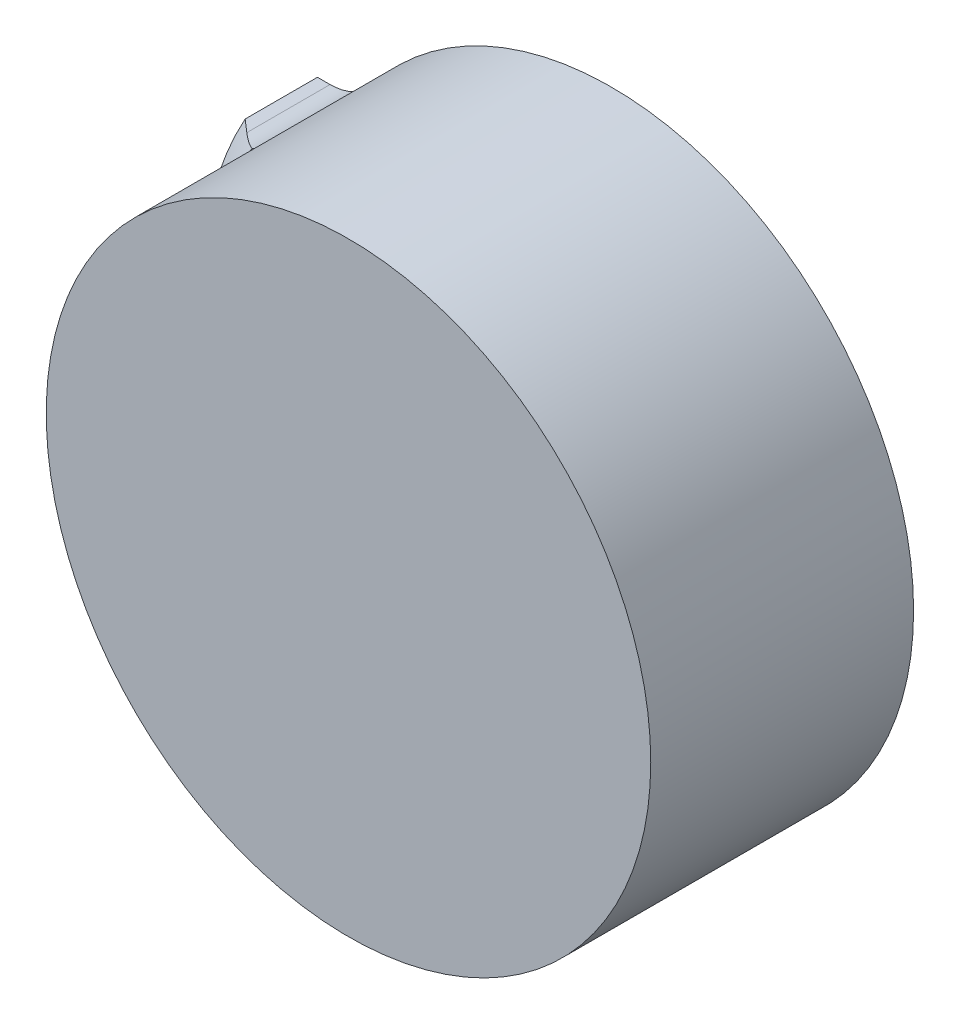
ISO-10303-21;
HEADER;
FILE_DESCRIPTION(('STEP AP214'),'2;1');
FILE_NAME('part.step','',(''),(''),'','','');
FILE_SCHEMA(('AUTOMOTIVE_DESIGN { 1 0 10303 214 1 1 1 1 }'));
ENDSEC;
DATA;
#1=APPLICATION_CONTEXT('core data for automotive mechanical design processes');
#2=APPLICATION_PROTOCOL_DEFINITION('international standard','automotive_design',2000,#1);
#3=PRODUCT_CONTEXT('',#1,'mechanical');
#4=PRODUCT('Part','Part','',(#3));
#5=PRODUCT_RELATED_PRODUCT_CATEGORY('part','',(#4));
#6=PRODUCT_DEFINITION_FORMATION('','',#4);
#7=PRODUCT_DEFINITION_CONTEXT('part definition',#1,'design');
#8=PRODUCT_DEFINITION('design','',#6,#7);
#9=PRODUCT_DEFINITION_SHAPE('','',#8);
#10=(LENGTH_UNIT() NAMED_UNIT(*) SI_UNIT(.MILLI.,.METRE.));
#11=(NAMED_UNIT(*) PLANE_ANGLE_UNIT() SI_UNIT($,.RADIAN.));
#12=(NAMED_UNIT(*) SI_UNIT($,.STERADIAN.) SOLID_ANGLE_UNIT());
#13=UNCERTAINTY_MEASURE_WITH_UNIT(LENGTH_MEASURE(1.E-05),#10,'distance_accuracy_value','');
#14=(GEOMETRIC_REPRESENTATION_CONTEXT(3) GLOBAL_UNCERTAINTY_ASSIGNED_CONTEXT((#13)) GLOBAL_UNIT_ASSIGNED_CONTEXT((#10,
#11,#12)) REPRESENTATION_CONTEXT('',''));
#15=CARTESIAN_POINT('',(0.,0.,0.));
#16=DIRECTION('',(0.,0.,1.));
#17=DIRECTION('',(1.,0.,0.));
#18=AXIS2_PLACEMENT_3D('',#15,#16,#17);
#19=CARTESIAN_POINT('',(0.,0.,20.));
#20=DIRECTION('',(0.,0.,-1.));
#21=DIRECTION('',(-1.,0.,0.));
#22=AXIS2_PLACEMENT_3D('',#19,#20,#21);
#23=CYLINDRICAL_SURFACE('',#22,23.);
#24=CARTESIAN_POINT('',(0.,0.,20.));
#25=DIRECTION('',(0.,0.,1.));
#26=DIRECTION('',(1.,0.,0.));
#27=AXIS2_PLACEMENT_3D('',#24,#25,#26);
#28=CIRCLE('',#27,23.);
#29=CARTESIAN_POINT('',(23.,0.,20.));
#30=VERTEX_POINT('',#29);
#31=EDGE_CURVE('E129',#30,#30,#28,.T.);
#32=ORIENTED_EDGE('',*,*,#31,.F.);
#33=EDGE_LOOP('',(#32));
#34=FACE_BOUND('',#33,.T.);
#35=CARTESIAN_POINT('',(0.,0.,7.5));
#36=DIRECTION('',(0.,0.,1.));
#37=DIRECTION('',(1.,0.,0.));
#38=AXIS2_PLACEMENT_3D('',#35,#36,#37);
#39=CIRCLE('',#38,23.);
#40=CARTESIAN_POINT('',(-18.2312203490727,14.0222182476083,7.5));
#41=VERTEX_POINT('',#40);
#42=CARTESIAN_POINT('',(-18.2312203490718,-14.0222182476094,7.5));
#43=VERTEX_POINT('',#42);
#44=EDGE_CURVE('E132',#41,#43,#39,.T.);
#45=ORIENTED_EDGE('',*,*,#44,.T.);
#46=DIRECTION('',(0.,0.,-1.));
#47=VECTOR('',#46,1.);
#48=CARTESIAN_POINT('',(-18.2312203490718,-14.0222182476094,20.));
#49=LINE('',#48,#47);
#50=CARTESIAN_POINT('',(-18.2312203490718,-14.0222182476094,0.));
#51=VERTEX_POINT('',#50);
#52=EDGE_CURVE('E170',#43,#51,#49,.T.);
#53=ORIENTED_EDGE('',*,*,#52,.T.);
#54=CARTESIAN_POINT('',(0.,0.,0.));
#55=DIRECTION('',(0.,0.,1.));
#56=DIRECTION('',(1.,0.,0.));
#57=AXIS2_PLACEMENT_3D('',#54,#55,#56);
#58=CIRCLE('',#57,23.);
#59=CARTESIAN_POINT('',(-18.2312203490727,14.0222182476083,0.));
#60=VERTEX_POINT('',#59);
#61=EDGE_CURVE('E109',#51,#60,#58,.T.);
#62=ORIENTED_EDGE('',*,*,#61,.T.);
#63=DIRECTION('',(0.,0.,-1.));
#64=VECTOR('',#63,1.);
#65=CARTESIAN_POINT('',(-18.2312203490727,14.0222182476083,20.));
#66=LINE('',#65,#64);
#67=EDGE_CURVE('E172',#60,#41,#66,.F.);
#68=ORIENTED_EDGE('',*,*,#67,.T.);
#69=EDGE_LOOP('',(#45,#53,#62,#68));
#70=FACE_BOUND('',#69,.T.);
#71=ADVANCED_FACE('F37',(#34,#70),#23,.T.);
#72=CARTESIAN_POINT('',(0.,0.,20.));
#73=DIRECTION('',(0.,0.,1.));
#74=DIRECTION('',(1.,0.,0.));
#75=AXIS2_PLACEMENT_3D('',#72,#73,#74);
#76=PLANE('',#75);
#77=ORIENTED_EDGE('',*,*,#31,.T.);
#78=EDGE_LOOP('',(#77));
#79=FACE_BOUND('',#78,.T.);
#80=ADVANCED_FACE('F157',(#79),#76,.T.);
#81=CARTESIAN_POINT('',(0.,0.,0.));
#82=DIRECTION('',(0.,0.,1.));
#83=DIRECTION('',(1.,0.,0.));
#84=AXIS2_PLACEMENT_3D('',#81,#82,#83);
#85=PLANE('',#84);
#86=ORIENTED_EDGE('',*,*,#61,.F.);
#87=CARTESIAN_POINT('',(-21.4018673663017,-16.4608648993676,0.));
#88=DIRECTION('',(0.,0.,1.));
#89=DIRECTION('',(1.,0.,0.));
#90=AXIS2_PLACEMENT_3D('',#87,#88,#89);
#91=CIRCLE('',#90,4.);
#92=CARTESIAN_POINT('',(-21.4018673663017,-12.4608648993676,0.));
#93=VERTEX_POINT('',#92);
#94=EDGE_CURVE('E119',#51,#93,#91,.T.);
#95=ORIENTED_EDGE('',*,*,#94,.T.);
#96=DIRECTION('',(1.,0.,0.));
#97=VECTOR('',#96,1.);
#98=CARTESIAN_POINT('',(-17.5671731433861,-12.4608648993676,0.));
#99=LINE('',#98,#97);
#100=CARTESIAN_POINT('',(-22.3626216253755,-12.4608648993676,0.));
#101=VERTEX_POINT('',#100);
#102=EDGE_CURVE('E102',#101,#93,#99,.T.);
#103=ORIENTED_EDGE('',*,*,#102,.F.);
#104=CARTESIAN_POINT('',(0.,0.,0.));
#105=DIRECTION('',(0.,0.,1.));
#106=DIRECTION('',(1.,0.,0.));
#107=AXIS2_PLACEMENT_3D('',#104,#105,#106);
#108=CIRCLE('',#107,25.6000000000001);
#109=CARTESIAN_POINT('',(-22.3626216253763,12.4608648993662,0.));
#110=VERTEX_POINT('',#109);
#111=EDGE_CURVE('E117',#110,#101,#108,.T.);
#112=ORIENTED_EDGE('',*,*,#111,.F.);
#113=DIRECTION('',(-1.,0.,0.));
#114=VECTOR('',#113,1.);
#115=CARTESIAN_POINT('',(-22.3626216253763,12.4608648993662,0.));
#116=LINE('',#115,#114);
#117=CARTESIAN_POINT('',(-21.4018673663027,12.4608648993662,0.));
#118=VERTEX_POINT('',#117);
#119=EDGE_CURVE('E120',#118,#110,#116,.T.);
#120=ORIENTED_EDGE('',*,*,#119,.F.);
#121=CARTESIAN_POINT('',(-21.4018673663027,16.4608648993662,0.));
#122=DIRECTION('',(0.,0.,1.));
#123=DIRECTION('',(1.,0.,0.));
#124=AXIS2_PLACEMENT_3D('',#121,#122,#123);
#125=CIRCLE('',#124,4.);
#126=EDGE_CURVE('E210',#118,#60,#125,.T.);
#127=ORIENTED_EDGE('',*,*,#126,.T.);
#128=EDGE_LOOP('',(#86,#95,#103,#112,#120,#127));
#129=FACE_BOUND('',#128,.T.);
#130=ADVANCED_FACE('F115',(#129),#85,.F.);
#131=CARTESIAN_POINT('',(0.,0.,7.5));
#132=DIRECTION('',(0.,0.,1.));
#133=DIRECTION('',(1.,0.,0.));
#134=AXIS2_PLACEMENT_3D('',#131,#132,#133);
#135=PLANE('',#134);
#136=ORIENTED_EDGE('',*,*,#44,.F.);
#137=CARTESIAN_POINT('',(-21.4018673663027,16.4608648993662,7.5));
#138=DIRECTION('',(0.,0.,1.));
#139=DIRECTION('',(1.,0.,0.));
#140=AXIS2_PLACEMENT_3D('',#137,#138,#139);
#141=CIRCLE('',#140,4.);
#142=CARTESIAN_POINT('',(-19.8416281950736,12.7777067805011,7.5));
#143=VERTEX_POINT('',#142);
#144=EDGE_CURVE('E50',#41,#143,#141,.F.);
#145=ORIENTED_EDGE('',*,*,#144,.T.);
#146=CARTESIAN_POINT('',(0.,0.,7.5));
#147=DIRECTION('',(0.,0.,1.));
#148=DIRECTION('',(1.,0.,0.));
#149=AXIS2_PLACEMENT_3D('',#146,#147,#148);
#150=CIRCLE('',#149,23.6000000000001);
#151=CARTESIAN_POINT('',(-19.8416281950728,-12.7777067805023,7.5));
#152=VERTEX_POINT('',#151);
#153=EDGE_CURVE('E56',#143,#152,#150,.T.);
#154=ORIENTED_EDGE('',*,*,#153,.T.);
#155=CARTESIAN_POINT('',(-21.4018673663017,-16.4608648993676,7.5));
#156=DIRECTION('',(0.,0.,1.));
#157=DIRECTION('',(1.,0.,0.));
#158=AXIS2_PLACEMENT_3D('',#155,#156,#157);
#159=CIRCLE('',#158,4.);
#160=EDGE_CURVE('E175',#152,#43,#159,.F.);
#161=ORIENTED_EDGE('',*,*,#160,.T.);
#162=EDGE_LOOP('',(#136,#145,#154,#161));
#163=FACE_BOUND('',#162,.T.);
#164=ADVANCED_FACE('F152',(#163),#135,.T.);
#165=CARTESIAN_POINT('',(-17.5671731433861,-12.4608648993676,7.5));
#166=DIRECTION('',(0.,1.,0.));
#167=DIRECTION('',(-1.,0.,0.));
#168=AXIS2_PLACEMENT_3D('',#165,#166,#167);
#169=PLANE('',#168);
#170=ORIENTED_EDGE('',*,*,#102,.T.);
#171=DIRECTION('',(0.,0.,1.));
#172=VECTOR('',#171,1.);
#173=CARTESIAN_POINT('',(-21.4018673663017,-12.4608648993676,7.5));
#174=LINE('',#173,#172);
#175=CARTESIAN_POINT('',(-21.4018673662919,-12.4608648993676,6.33484139350931));
#176=VERTEX_POINT('',#175);
#177=EDGE_CURVE('E184',#93,#176,#174,.T.);
#178=ORIENTED_EDGE('',*,*,#177,.T.);
#179=CARTESIAN_POINT('',(-20.042126782348,-12.4608648993676,7.5));
#180=CARTESIAN_POINT('',(-20.236715073683,-12.4608648993676,7.33474589087189));
#181=CARTESIAN_POINT('',(-20.4309735375352,-12.4608648993676,7.16910381981382));
#182=CARTESIAN_POINT('',(-20.8188691523694,-12.4608648993676,6.83709846617195));
#183=CARTESIAN_POINT('',(-21.012506310852,-12.4608648993676,6.6707351923522));
#184=CARTESIAN_POINT('',(-21.3992020989106,-12.4608648993676,6.33733837255195));
#185=CARTESIAN_POINT('',(-21.5922607293008,-12.4608648993676,6.17030482751557));
#186=CARTESIAN_POINT('',(-21.9778378905571,-12.4608648993676,5.83561076105091));
#187=CARTESIAN_POINT('',(-22.1703564148509,-12.4608648993676,5.66795023205061));
#188=CARTESIAN_POINT('',(-22.3626216253755,-12.4608648993676,5.5));
#189=B_SPLINE_CURVE_WITH_KNOTS('',3,(#179,#180,#181,#182,#183,#184,#185,#186,#187,#188),
.UNSPECIFIED.,.F.,.F.,(4,2,2,2,4),(0.,0.765872277619347,1.53173527430974,2.29759719261576,
3.06346839021404),.UNSPECIFIED.);
#190=CARTESIAN_POINT('',(-22.3626216253755,-12.4608648993676,5.49999999999999));
#191=VERTEX_POINT('',#190);
#192=EDGE_CURVE('E105',#176,#191,#189,.T.);
#193=ORIENTED_EDGE('',*,*,#192,.T.);
#194=DIRECTION('',(0.,0.,-1.));
#195=VECTOR('',#194,1.);
#196=CARTESIAN_POINT('',(-22.3626216253755,-12.4608648993676,7.5));
#197=LINE('',#196,#195);
#198=EDGE_CURVE('E98',#191,#101,#197,.T.);
#199=ORIENTED_EDGE('',*,*,#198,.T.);
#200=EDGE_LOOP('',(#170,#178,#193,#199));
#201=FACE_BOUND('',#200,.T.);
#202=ADVANCED_FACE('F100',(#201),#169,.F.);
#203=CARTESIAN_POINT('',(-22.3626216253763,12.4608648993662,7.5));
#204=DIRECTION('',(0.,-1.,0.));
#205=DIRECTION('',(1.,0.,0.));
#206=AXIS2_PLACEMENT_3D('',#203,#204,#205);
#207=PLANE('',#206);
#208=CARTESIAN_POINT('',(-22.3626216253763,12.4608648993662,5.49999999999999));
#209=CARTESIAN_POINT('',(-22.1703564148517,12.4608648993662,5.66795023205061));
#210=CARTESIAN_POINT('',(-21.9778378905579,12.4608648993662,5.8356107610509));
#211=CARTESIAN_POINT('',(-21.5922607293016,12.4608648993662,6.17030482751557));
#212=CARTESIAN_POINT('',(-21.3992020989114,12.4608648993662,6.33733837255195));
#213=CARTESIAN_POINT('',(-21.0125063108528,12.4608648993662,6.6707351923522));
#214=CARTESIAN_POINT('',(-20.8188691523702,12.4608648993662,6.83709846617194));
#215=CARTESIAN_POINT('',(-20.430973537536,12.4608648993662,7.16910381981382));
#216=CARTESIAN_POINT('',(-20.2367150736839,12.4608648993662,7.33474589087189));
#217=CARTESIAN_POINT('',(-20.0421267823489,12.4608648993662,7.5));
#218=B_SPLINE_CURVE_WITH_KNOTS('',3,(#208,#209,#210,#211,#212,#213,#214,#215,#216,#217),
.UNSPECIFIED.,.F.,.F.,(4,2,2,2,4),(0.,0.765871197598267,1.53173311590427,2.29759611259464,
3.06346839021398),.UNSPECIFIED.);
#219=CARTESIAN_POINT('',(-22.3626216253763,12.4608648993662,5.49999999999999));
#220=VERTEX_POINT('',#219);
#221=CARTESIAN_POINT('',(-21.4018673662966,12.4608648993662,6.33484139350599));
#222=VERTEX_POINT('',#221);
#223=EDGE_CURVE('E203',#220,#222,#218,.T.);
#224=ORIENTED_EDGE('',*,*,#223,.T.);
#225=DIRECTION('',(0.,0.,1.));
#226=VECTOR('',#225,1.);
#227=CARTESIAN_POINT('',(-21.4018673663027,12.4608648993662,0.));
#228=LINE('',#227,#226);
#229=EDGE_CURVE('E180',#222,#118,#228,.F.);
#230=ORIENTED_EDGE('',*,*,#229,.T.);
#231=ORIENTED_EDGE('',*,*,#119,.T.);
#232=DIRECTION('',(0.,0.,-1.));
#233=VECTOR('',#232,1.);
#234=CARTESIAN_POINT('',(-22.3626216253763,12.4608648993662,7.5));
#235=LINE('',#234,#233);
#236=EDGE_CURVE('E110',#220,#110,#235,.T.);
#237=ORIENTED_EDGE('',*,*,#236,.F.);
#238=EDGE_LOOP('',(#224,#230,#231,#237));
#239=FACE_BOUND('',#238,.T.);
#240=ADVANCED_FACE('F151',(#239),#207,.F.);
#241=CARTESIAN_POINT('',(0.,0.,7.5));
#242=DIRECTION('',(0.,0.,-1.));
#243=DIRECTION('',(-1.,0.,0.));
#244=AXIS2_PLACEMENT_3D('',#241,#242,#243);
#245=CYLINDRICAL_SURFACE('',#244,25.6000000000001);
#246=ORIENTED_EDGE('',*,*,#198,.F.);
#247=CARTESIAN_POINT('',(0.,0.,5.49999999999999));
#248=DIRECTION('',(0.,0.,1.));
#249=DIRECTION('',(1.,0.,0.));
#250=AXIS2_PLACEMENT_3D('',#247,#248,#249);
#251=CIRCLE('',#250,25.6000000000001);
#252=EDGE_CURVE('E142',#191,#220,#251,.F.);
#253=ORIENTED_EDGE('',*,*,#252,.T.);
#254=ORIENTED_EDGE('',*,*,#236,.T.);
#255=ORIENTED_EDGE('',*,*,#111,.T.);
#256=EDGE_LOOP('',(#246,#253,#254,#255));
#257=FACE_BOUND('',#256,.T.);
#258=ADVANCED_FACE('F123',(#257),#245,.T.);
#259=CARTESIAN_POINT('',(0.,0.,7.5));
#260=DIRECTION('',(0.,0.,-1.));
#261=DIRECTION('',(-1.,0.,0.));
#262=AXIS2_PLACEMENT_3D('',#259,#260,#261);
#263=CONICAL_SURFACE('',#262,23.6000000000001,0.785398163397447);
#264=ORIENTED_EDGE('',*,*,#223,.F.);
#265=ORIENTED_EDGE('',*,*,#252,.F.);
#266=ORIENTED_EDGE('',*,*,#192,.F.);
#267=CARTESIAN_POINT('',(-21.4018673663017,-12.4608648993676,6.3348413935206));
#268=CARTESIAN_POINT('',(-21.276239795162,-12.4609021037195,6.4433727809305));
#269=CARTESIAN_POINT('',(-21.1489682005586,-12.466786674212,6.55017292306541));
#270=CARTESIAN_POINT('',(-20.8928266102855,-12.4913103213643,6.75791445712378));
#271=CARTESIAN_POINT('',(-20.763980841035,-12.5098356850073,6.85889944969188));
#272=CARTESIAN_POINT('',(-20.5040608154514,-12.560674668573,7.05464539435481));
#273=CARTESIAN_POINT('',(-20.3729854075836,-12.5929956347087,7.14940299927344));
#274=CARTESIAN_POINT('',(-20.1085096063217,-12.6732000433928,7.33129182756456));
#275=CARTESIAN_POINT('',(-19.9750989042209,-12.7212204627309,7.41834702924776));
#276=CARTESIAN_POINT('',(-19.8416281950733,-12.7777067805011,7.50000000000058));
#277=B_SPLINE_CURVE_WITH_KNOTS('',3,(#267,#268,#269,#270,#271,#272,#273,#274,#275,#276),
.UNSPECIFIED.,.F.,.F.,(4,2,2,2,4),(0.,0.498088602381008,0.991754604912203,1.48568381515227,
1.98404297536846),.UNSPECIFIED.);
#278=EDGE_CURVE('E177',#176,#152,#277,.T.);
#279=ORIENTED_EDGE('',*,*,#278,.T.);
#280=ORIENTED_EDGE('',*,*,#153,.F.);
#281=CARTESIAN_POINT('',(-19.8416281950736,12.7777067805011,7.5));
#282=CARTESIAN_POINT('',(-19.975098904222,12.72122046273,7.41834702924775));
#283=CARTESIAN_POINT('',(-20.1085096063231,12.6732000433914,7.33129182756429));
#284=CARTESIAN_POINT('',(-20.3729854075856,12.5929956347069,7.14940299927241));
#285=CARTESIAN_POINT('',(-20.5040608154536,12.5606746685713,7.05464539435329));
#286=CARTESIAN_POINT('',(-20.7639808410386,12.5098356850056,6.85889944969027));
#287=CARTESIAN_POINT('',(-20.8928266102901,12.4913103213626,6.75791445712256));
#288=CARTESIAN_POINT('',(-21.1489682005623,12.4667866742104,6.55017292306112));
#289=CARTESIAN_POINT('',(-21.2762397951638,12.460902103718,6.44337278092272));
#290=CARTESIAN_POINT('',(-21.4018673662977,12.4608648993662,6.33484139350498));
#291=B_SPLINE_CURVE_WITH_KNOTS('',3,(#281,#282,#283,#284,#285,#286,#287,#288,#289,#290),
.UNSPECIFIED.,.F.,.F.,(4,2,2,2,4),(0.,0.498359160217906,0.992288370459276,1.48595437299223,
1.98404297537533),.UNSPECIFIED.);
#292=EDGE_CURVE('E11',#143,#222,#291,.T.);
#293=ORIENTED_EDGE('',*,*,#292,.T.);
#294=EDGE_LOOP('',(#264,#265,#266,#279,#280,#293));
#295=FACE_BOUND('',#294,.T.);
#296=ADVANCED_FACE('F144',(#295),#263,.T.);
#297=CARTESIAN_POINT('',(-21.4018673663017,-16.4608648993676,20.));
#298=DIRECTION('',(0.,0.,-1.));
#299=DIRECTION('',(-1.,0.,0.));
#300=AXIS2_PLACEMENT_3D('',#297,#298,#299);
#301=CYLINDRICAL_SURFACE('',#300,4.);
#302=ORIENTED_EDGE('',*,*,#94,.F.);
#303=ORIENTED_EDGE('',*,*,#52,.F.);
#304=ORIENTED_EDGE('',*,*,#160,.F.);
#305=ORIENTED_EDGE('',*,*,#278,.F.);
#306=ORIENTED_EDGE('',*,*,#177,.F.);
#307=EDGE_LOOP('',(#302,#303,#304,#305,#306));
#308=FACE_BOUND('',#307,.T.);
#309=ADVANCED_FACE('F179',(#308),#301,.F.);
#310=CARTESIAN_POINT('',(-21.4018673663027,16.4608648993662,20.));
#311=DIRECTION('',(0.,0.,-1.));
#312=DIRECTION('',(-1.,0.,0.));
#313=AXIS2_PLACEMENT_3D('',#310,#311,#312);
#314=CYLINDRICAL_SURFACE('',#313,4.);
#315=ORIENTED_EDGE('',*,*,#144,.F.);
#316=ORIENTED_EDGE('',*,*,#67,.F.);
#317=ORIENTED_EDGE('',*,*,#126,.F.);
#318=ORIENTED_EDGE('',*,*,#229,.F.);
#319=ORIENTED_EDGE('',*,*,#292,.F.);
#320=EDGE_LOOP('',(#315,#316,#317,#318,#319));
#321=FACE_BOUND('',#320,.T.);
#322=ADVANCED_FACE('F39',(#321),#314,.F.);
#323=CLOSED_SHELL('',(#71,#80,#130,#164,#202,#240,#258,#296,#309,#322));
#324=MANIFOLD_SOLID_BREP('B2',#323);
#325=ADVANCED_BREP_SHAPE_REPRESENTATION('',(#18,#324),#14);
#326=SHAPE_DEFINITION_REPRESENTATION(#9,#325);
ENDSEC;
END-ISO-10303-21;
